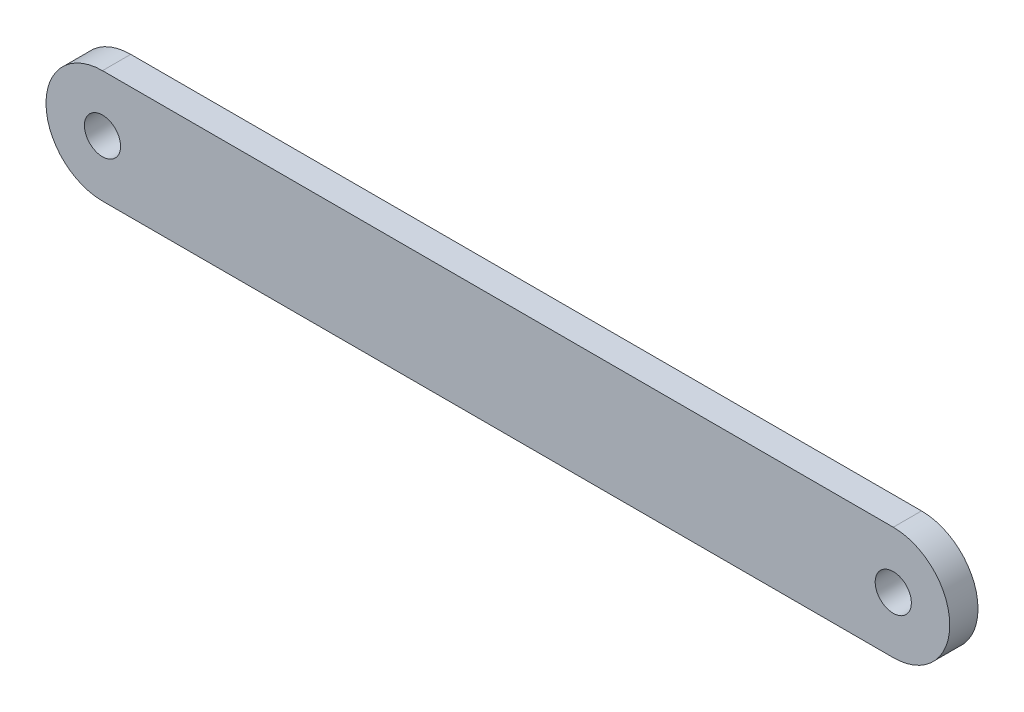
ISO-10303-21;
HEADER;
FILE_DESCRIPTION(('STEP AP214'),'2;1');
FILE_NAME('part.step','',(''),(''),'','','');
FILE_SCHEMA(('AUTOMOTIVE_DESIGN { 1 0 10303 214 1 1 1 1 }'));
ENDSEC;
DATA;
#1=APPLICATION_CONTEXT('core data for automotive mechanical design processes');
#2=APPLICATION_PROTOCOL_DEFINITION('international standard','automotive_design',2000,#1);
#3=PRODUCT_CONTEXT('',#1,'mechanical');
#4=PRODUCT('Part','Part','',(#3));
#5=PRODUCT_RELATED_PRODUCT_CATEGORY('part','',(#4));
#6=PRODUCT_DEFINITION_FORMATION('','',#4);
#7=PRODUCT_DEFINITION_CONTEXT('part definition',#1,'design');
#8=PRODUCT_DEFINITION('design','',#6,#7);
#9=PRODUCT_DEFINITION_SHAPE('','',#8);
#10=(LENGTH_UNIT() NAMED_UNIT(*) SI_UNIT(.MILLI.,.METRE.));
#11=(NAMED_UNIT(*) PLANE_ANGLE_UNIT() SI_UNIT($,.RADIAN.));
#12=(NAMED_UNIT(*) SI_UNIT($,.STERADIAN.) SOLID_ANGLE_UNIT());
#13=UNCERTAINTY_MEASURE_WITH_UNIT(LENGTH_MEASURE(1.E-05),#10,'distance_accuracy_value','');
#14=(GEOMETRIC_REPRESENTATION_CONTEXT(3) GLOBAL_UNCERTAINTY_ASSIGNED_CONTEXT((#13)) GLOBAL_UNIT_ASSIGNED_CONTEXT((#10,
#11,#12)) REPRESENTATION_CONTEXT('',''));
#15=CARTESIAN_POINT('',(0.,0.,0.));
#16=DIRECTION('',(0.,0.,1.));
#17=DIRECTION('',(1.,0.,0.));
#18=AXIS2_PLACEMENT_3D('',#15,#16,#17);
#19=CARTESIAN_POINT('',(0.,0.,3.175));
#20=DIRECTION('',(0.,0.,1.));
#21=DIRECTION('',(1.,0.,0.));
#22=AXIS2_PLACEMENT_3D('',#19,#20,#21);
#23=PLANE('',#22);
#24=CARTESIAN_POINT('',(0.,0.,3.175));
#25=DIRECTION('',(0.,0.,1.));
#26=DIRECTION('',(1.,0.,0.));
#27=AXIS2_PLACEMENT_3D('',#24,#25,#26);
#28=CIRCLE('',#27,2.032);
#29=CARTESIAN_POINT('',(2.032,0.,3.175));
#30=VERTEX_POINT('',#29);
#31=EDGE_CURVE('E127',#30,#30,#28,.T.);
#32=ORIENTED_EDGE('',*,*,#31,.F.);
#33=EDGE_LOOP('',(#32));
#34=FACE_BOUND('',#33,.T.);
#35=CARTESIAN_POINT('',(0.,0.,3.175));
#36=DIRECTION('',(0.,0.,1.));
#37=DIRECTION('',(1.,0.,0.));
#38=AXIS2_PLACEMENT_3D('',#35,#36,#37);
#39=CIRCLE('',#38,6.35);
#40=CARTESIAN_POINT('',(0.,-6.35,3.175));
#41=VERTEX_POINT('',#40);
#42=CARTESIAN_POINT('',(0.,6.35,3.175));
#43=VERTEX_POINT('',#42);
#44=EDGE_CURVE('E106',#41,#43,#39,.T.);
#45=ORIENTED_EDGE('',*,*,#44,.T.);
#46=DIRECTION('',(-1.,0.,0.));
#47=VECTOR('',#46,1.);
#48=CARTESIAN_POINT('',(0.,6.35,3.175));
#49=LINE('',#48,#47);
#50=CARTESIAN_POINT('',(-88.9,6.34999999999999,3.175));
#51=VERTEX_POINT('',#50);
#52=EDGE_CURVE('E100',#43,#51,#49,.T.);
#53=ORIENTED_EDGE('',*,*,#52,.T.);
#54=CARTESIAN_POINT('',(-88.9,0.,3.175));
#55=DIRECTION('',(0.,0.,1.));
#56=DIRECTION('',(1.,0.,0.));
#57=AXIS2_PLACEMENT_3D('',#54,#55,#56);
#58=CIRCLE('',#57,6.35);
#59=CARTESIAN_POINT('',(-88.9,-6.35000000000001,3.175));
#60=VERTEX_POINT('',#59);
#61=EDGE_CURVE('E104',#51,#60,#58,.T.);
#62=ORIENTED_EDGE('',*,*,#61,.T.);
#63=DIRECTION('',(1.,0.,0.));
#64=VECTOR('',#63,1.);
#65=CARTESIAN_POINT('',(0.,-6.35,3.175));
#66=LINE('',#65,#64);
#67=EDGE_CURVE('E66',#60,#41,#66,.T.);
#68=ORIENTED_EDGE('',*,*,#67,.T.);
#69=EDGE_LOOP('',(#45,#53,#62,#68));
#70=FACE_BOUND('',#69,.T.);
#71=CARTESIAN_POINT('',(-88.9,0.,3.175));
#72=DIRECTION('',(0.,0.,1.));
#73=DIRECTION('',(1.,0.,0.));
#74=AXIS2_PLACEMENT_3D('',#71,#72,#73);
#75=CIRCLE('',#74,2.03200000000001);
#76=CARTESIAN_POINT('',(-86.868,0.,3.175));
#77=VERTEX_POINT('',#76);
#78=EDGE_CURVE('E149',#77,#77,#75,.T.);
#79=ORIENTED_EDGE('',*,*,#78,.F.);
#80=EDGE_LOOP('',(#79));
#81=FACE_BOUND('',#80,.T.);
#82=ADVANCED_FACE('F45',(#34,#70,#81),#23,.T.);
#83=CARTESIAN_POINT('',(0.,0.,0.));
#84=DIRECTION('',(0.,0.,1.));
#85=DIRECTION('',(1.,0.,0.));
#86=AXIS2_PLACEMENT_3D('',#83,#84,#85);
#87=PLANE('',#86);
#88=CARTESIAN_POINT('',(0.,0.,0.));
#89=DIRECTION('',(0.,0.,1.));
#90=DIRECTION('',(1.,0.,0.));
#91=AXIS2_PLACEMENT_3D('',#88,#89,#90);
#92=CIRCLE('',#91,6.35);
#93=CARTESIAN_POINT('',(0.,-6.35,0.));
#94=VERTEX_POINT('',#93);
#95=CARTESIAN_POINT('',(0.,6.35,0.));
#96=VERTEX_POINT('',#95);
#97=EDGE_CURVE('E123',#94,#96,#92,.T.);
#98=ORIENTED_EDGE('',*,*,#97,.F.);
#99=DIRECTION('',(1.,0.,0.));
#100=VECTOR('',#99,1.);
#101=CARTESIAN_POINT('',(0.,-6.35,0.));
#102=LINE('',#101,#100);
#103=CARTESIAN_POINT('',(-88.9,-6.35000000000001,0.));
#104=VERTEX_POINT('',#103);
#105=EDGE_CURVE('E93',#104,#94,#102,.T.);
#106=ORIENTED_EDGE('',*,*,#105,.F.);
#107=CARTESIAN_POINT('',(-88.9,0.,0.));
#108=DIRECTION('',(0.,0.,1.));
#109=DIRECTION('',(1.,0.,0.));
#110=AXIS2_PLACEMENT_3D('',#107,#108,#109);
#111=CIRCLE('',#110,6.35);
#112=CARTESIAN_POINT('',(-88.9,6.34999999999999,0.));
#113=VERTEX_POINT('',#112);
#114=EDGE_CURVE('E86',#113,#104,#111,.T.);
#115=ORIENTED_EDGE('',*,*,#114,.F.);
#116=DIRECTION('',(-1.,0.,0.));
#117=VECTOR('',#116,1.);
#118=CARTESIAN_POINT('',(0.,6.35,0.));
#119=LINE('',#118,#117);
#120=EDGE_CURVE('E111',#96,#113,#119,.T.);
#121=ORIENTED_EDGE('',*,*,#120,.F.);
#122=EDGE_LOOP('',(#98,#106,#115,#121));
#123=FACE_BOUND('',#122,.T.);
#124=CARTESIAN_POINT('',(0.,0.,0.));
#125=DIRECTION('',(0.,0.,1.));
#126=DIRECTION('',(1.,0.,0.));
#127=AXIS2_PLACEMENT_3D('',#124,#125,#126);
#128=CIRCLE('',#127,2.032);
#129=CARTESIAN_POINT('',(2.032,0.,0.));
#130=VERTEX_POINT('',#129);
#131=EDGE_CURVE('E145',#130,#130,#128,.T.);
#132=ORIENTED_EDGE('',*,*,#131,.T.);
#133=EDGE_LOOP('',(#132));
#134=FACE_BOUND('',#133,.T.);
#135=CARTESIAN_POINT('',(-88.9,0.,0.));
#136=DIRECTION('',(0.,0.,1.));
#137=DIRECTION('',(1.,0.,0.));
#138=AXIS2_PLACEMENT_3D('',#135,#136,#137);
#139=CIRCLE('',#138,2.03200000000001);
#140=CARTESIAN_POINT('',(-86.868,0.,0.));
#141=VERTEX_POINT('',#140);
#142=EDGE_CURVE('E152',#141,#141,#139,.T.);
#143=ORIENTED_EDGE('',*,*,#142,.T.);
#144=EDGE_LOOP('',(#143));
#145=FACE_BOUND('',#144,.T.);
#146=ADVANCED_FACE('F139',(#123,#134,#145),#87,.F.);
#147=CARTESIAN_POINT('',(0.,0.,3.175));
#148=DIRECTION('',(0.,0.,-1.));
#149=DIRECTION('',(-1.,0.,0.));
#150=AXIS2_PLACEMENT_3D('',#147,#148,#149);
#151=CYLINDRICAL_SURFACE('',#150,6.35);
#152=ORIENTED_EDGE('',*,*,#97,.T.);
#153=DIRECTION('',(0.,0.,-1.));
#154=VECTOR('',#153,1.);
#155=CARTESIAN_POINT('',(0.,6.35,3.175));
#156=LINE('',#155,#154);
#157=EDGE_CURVE('E11',#43,#96,#156,.T.);
#158=ORIENTED_EDGE('',*,*,#157,.F.);
#159=ORIENTED_EDGE('',*,*,#44,.F.);
#160=DIRECTION('',(0.,0.,-1.));
#161=VECTOR('',#160,1.);
#162=CARTESIAN_POINT('',(0.,-6.35,3.175));
#163=LINE('',#162,#161);
#164=EDGE_CURVE('E119',#41,#94,#163,.T.);
#165=ORIENTED_EDGE('',*,*,#164,.T.);
#166=EDGE_LOOP('',(#152,#158,#159,#165));
#167=FACE_BOUND('',#166,.T.);
#168=ADVANCED_FACE('F47',(#167),#151,.T.);
#169=CARTESIAN_POINT('',(0.,6.35,3.175));
#170=DIRECTION('',(0.,-1.,0.));
#171=DIRECTION('',(1.,0.,0.));
#172=AXIS2_PLACEMENT_3D('',#169,#170,#171);
#173=PLANE('',#172);
#174=ORIENTED_EDGE('',*,*,#120,.T.);
#175=DIRECTION('',(0.,0.,-1.));
#176=VECTOR('',#175,1.);
#177=CARTESIAN_POINT('',(-88.9,6.34999999999999,3.175));
#178=LINE('',#177,#176);
#179=EDGE_CURVE('E55',#51,#113,#178,.T.);
#180=ORIENTED_EDGE('',*,*,#179,.F.);
#181=ORIENTED_EDGE('',*,*,#52,.F.);
#182=ORIENTED_EDGE('',*,*,#157,.T.);
#183=EDGE_LOOP('',(#174,#180,#181,#182));
#184=FACE_BOUND('',#183,.T.);
#185=ADVANCED_FACE('F110',(#184),#173,.F.);
#186=CARTESIAN_POINT('',(-88.9,0.,3.175));
#187=DIRECTION('',(0.,0.,-1.));
#188=DIRECTION('',(-1.,0.,0.));
#189=AXIS2_PLACEMENT_3D('',#186,#187,#188);
#190=CYLINDRICAL_SURFACE('',#189,6.35);
#191=ORIENTED_EDGE('',*,*,#114,.T.);
#192=DIRECTION('',(0.,0.,-1.));
#193=VECTOR('',#192,1.);
#194=CARTESIAN_POINT('',(-88.9,-6.35000000000001,3.175));
#195=LINE('',#194,#193);
#196=EDGE_CURVE('E113',#60,#104,#195,.T.);
#197=ORIENTED_EDGE('',*,*,#196,.F.);
#198=ORIENTED_EDGE('',*,*,#61,.F.);
#199=ORIENTED_EDGE('',*,*,#179,.T.);
#200=EDGE_LOOP('',(#191,#197,#198,#199));
#201=FACE_BOUND('',#200,.T.);
#202=ADVANCED_FACE('F114',(#201),#190,.T.);
#203=CARTESIAN_POINT('',(0.,-6.35,3.175));
#204=DIRECTION('',(0.,1.,0.));
#205=DIRECTION('',(-1.,0.,0.));
#206=AXIS2_PLACEMENT_3D('',#203,#204,#205);
#207=PLANE('',#206);
#208=ORIENTED_EDGE('',*,*,#105,.T.);
#209=ORIENTED_EDGE('',*,*,#164,.F.);
#210=ORIENTED_EDGE('',*,*,#67,.F.);
#211=ORIENTED_EDGE('',*,*,#196,.T.);
#212=EDGE_LOOP('',(#208,#209,#210,#211));
#213=FACE_BOUND('',#212,.T.);
#214=ADVANCED_FACE('F136',(#213),#207,.F.);
#215=CARTESIAN_POINT('',(0.,0.,3.175));
#216=DIRECTION('',(0.,0.,-1.));
#217=DIRECTION('',(-1.,0.,0.));
#218=AXIS2_PLACEMENT_3D('',#215,#216,#217);
#219=CYLINDRICAL_SURFACE('',#218,2.032);
#220=ORIENTED_EDGE('',*,*,#31,.T.);
#221=EDGE_LOOP('',(#220));
#222=FACE_BOUND('',#221,.T.);
#223=ORIENTED_EDGE('',*,*,#131,.F.);
#224=EDGE_LOOP('',(#223));
#225=FACE_BOUND('',#224,.T.);
#226=ADVANCED_FACE('F170',(#222,#225),#219,.F.);
#227=CARTESIAN_POINT('',(-88.9,0.,3.175));
#228=DIRECTION('',(0.,0.,-1.));
#229=DIRECTION('',(-1.,0.,0.));
#230=AXIS2_PLACEMENT_3D('',#227,#228,#229);
#231=CYLINDRICAL_SURFACE('',#230,2.03200000000001);
#232=ORIENTED_EDGE('',*,*,#78,.T.);
#233=EDGE_LOOP('',(#232));
#234=FACE_BOUND('',#233,.T.);
#235=ORIENTED_EDGE('',*,*,#142,.F.);
#236=EDGE_LOOP('',(#235));
#237=FACE_BOUND('',#236,.T.);
#238=ADVANCED_FACE('F160',(#234,#237),#231,.F.);
#239=CLOSED_SHELL('',(#82,#146,#168,#185,#202,#214,#226,#238));
#240=MANIFOLD_SOLID_BREP('B2',#239);
#241=ADVANCED_BREP_SHAPE_REPRESENTATION('',(#18,#240),#14);
#242=SHAPE_DEFINITION_REPRESENTATION(#9,#241);
ENDSEC;
END-ISO-10303-21;
